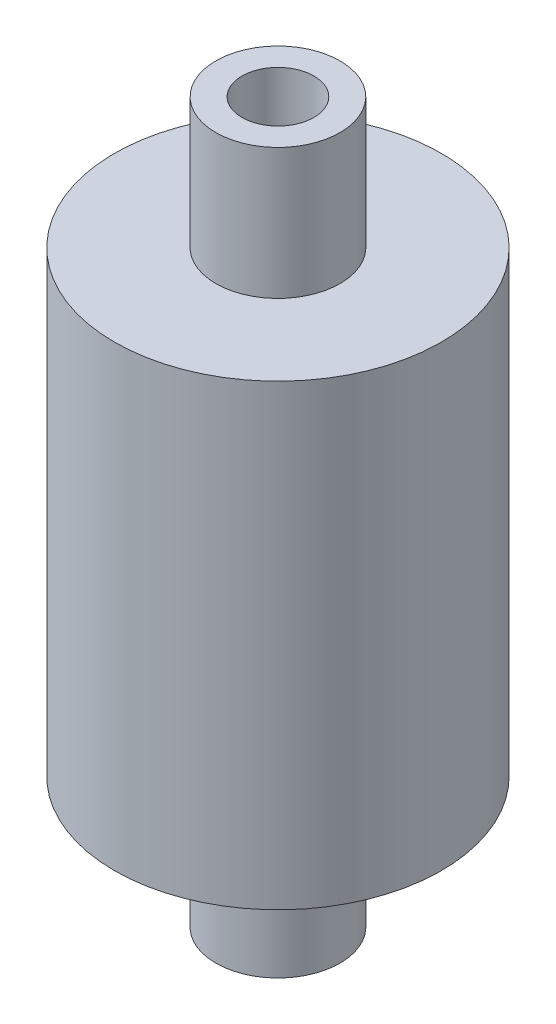
ISO-10303-21;
HEADER;
FILE_DESCRIPTION(('STEP AP214'),'2;1');
FILE_NAME('part.step','',(''),(''),'','','');
FILE_SCHEMA(('AUTOMOTIVE_DESIGN { 1 0 10303 214 1 1 1 1 }'));
ENDSEC;
DATA;
#1=APPLICATION_CONTEXT('core data for automotive mechanical design processes');
#2=APPLICATION_PROTOCOL_DEFINITION('international standard','automotive_design',2000,#1);
#3=PRODUCT_CONTEXT('',#1,'mechanical');
#4=PRODUCT('Part','Part','',(#3));
#5=PRODUCT_RELATED_PRODUCT_CATEGORY('part','',(#4));
#6=PRODUCT_DEFINITION_FORMATION('','',#4);
#7=PRODUCT_DEFINITION_CONTEXT('part definition',#1,'design');
#8=PRODUCT_DEFINITION('design','',#6,#7);
#9=PRODUCT_DEFINITION_SHAPE('','',#8);
#10=(LENGTH_UNIT() NAMED_UNIT(*) SI_UNIT(.MILLI.,.METRE.));
#11=(NAMED_UNIT(*) PLANE_ANGLE_UNIT() SI_UNIT($,.RADIAN.));
#12=(NAMED_UNIT(*) SI_UNIT($,.STERADIAN.) SOLID_ANGLE_UNIT());
#13=UNCERTAINTY_MEASURE_WITH_UNIT(LENGTH_MEASURE(1.E-05),#10,'distance_accuracy_value','');
#14=(GEOMETRIC_REPRESENTATION_CONTEXT(3) GLOBAL_UNCERTAINTY_ASSIGNED_CONTEXT((#13)) GLOBAL_UNIT_ASSIGNED_CONTEXT((#10,
#11,#12)) REPRESENTATION_CONTEXT('',''));
#15=CARTESIAN_POINT('',(0.,0.,0.));
#16=DIRECTION('',(0.,0.,1.));
#17=DIRECTION('',(1.,0.,0.));
#18=AXIS2_PLACEMENT_3D('',#15,#16,#17);
#19=CARTESIAN_POINT('',(0.,27.5,4.75000000000001));
#20=DIRECTION('',(0.,1.,0.));
#21=DIRECTION('',(0.,0.,1.));
#22=AXIS2_PLACEMENT_3D('',#19,#20,#21);
#23=PLANE('',#22);
#24=CARTESIAN_POINT('',(0.,27.5,0.));
#25=DIRECTION('',(0.,1.,0.));
#26=DIRECTION('',(0.,0.,1.));
#27=AXIS2_PLACEMENT_3D('',#24,#25,#26);
#28=CIRCLE('',#27,4.75000000000001);
#29=CARTESIAN_POINT('',(0.,27.5,4.75000000000001));
#30=VERTEX_POINT('',#29);
#31=EDGE_CURVE('E61',#30,#30,#28,.T.);
#32=ORIENTED_EDGE('',*,*,#31,.T.);
#33=EDGE_LOOP('',(#32));
#34=FACE_BOUND('',#33,.T.);
#35=CARTESIAN_POINT('',(0.,27.5,0.));
#36=DIRECTION('',(0.,1.,0.));
#37=DIRECTION('',(0.,0.,1.));
#38=AXIS2_PLACEMENT_3D('',#35,#36,#37);
#39=CIRCLE('',#38,2.75000000000001);
#40=CARTESIAN_POINT('',(0.,27.5,2.75000000000001));
#41=VERTEX_POINT('',#40);
#42=EDGE_CURVE('E10',#41,#41,#39,.T.);
#43=ORIENTED_EDGE('',*,*,#42,.F.);
#44=EDGE_LOOP('',(#43));
#45=FACE_BOUND('',#44,.T.);
#46=ADVANCED_FACE('F33',(#34,#45),#23,.T.);
#47=CARTESIAN_POINT('',(0.,59.0476190476191,0.));
#48=DIRECTION('',(0.,1.,0.));
#49=DIRECTION('',(0.,0.,1.));
#50=AXIS2_PLACEMENT_3D('',#47,#48,#49);
#51=CYLINDRICAL_SURFACE('',#50,2.75000000000001);
#52=ORIENTED_EDGE('',*,*,#42,.T.);
#53=EDGE_LOOP('',(#52));
#54=FACE_BOUND('',#53,.T.);
#55=CARTESIAN_POINT('',(0.,-27.5,0.));
#56=DIRECTION('',(0.,1.,0.));
#57=DIRECTION('',(0.,0.,1.));
#58=AXIS2_PLACEMENT_3D('',#55,#56,#57);
#59=CIRCLE('',#58,2.75000000000001);
#60=CARTESIAN_POINT('',(0.,-27.5,2.75000000000001));
#61=VERTEX_POINT('',#60);
#62=EDGE_CURVE('E39',#61,#61,#59,.T.);
#63=ORIENTED_EDGE('',*,*,#62,.F.);
#64=EDGE_LOOP('',(#63));
#65=FACE_BOUND('',#64,.T.);
#66=ADVANCED_FACE('F79',(#54,#65),#51,.F.);
#67=CARTESIAN_POINT('',(0.,-27.5,2.75000000000001));
#68=DIRECTION('',(0.,-1.,0.));
#69=DIRECTION('',(0.,0.,-1.));
#70=AXIS2_PLACEMENT_3D('',#67,#68,#69);
#71=PLANE('',#70);
#72=ORIENTED_EDGE('',*,*,#62,.T.);
#73=EDGE_LOOP('',(#72));
#74=FACE_BOUND('',#73,.T.);
#75=CARTESIAN_POINT('',(0.,-27.5,0.));
#76=DIRECTION('',(0.,1.,0.));
#77=DIRECTION('',(0.,0.,1.));
#78=AXIS2_PLACEMENT_3D('',#75,#76,#77);
#79=CIRCLE('',#78,4.75);
#80=CARTESIAN_POINT('',(0.,-27.5,4.75));
#81=VERTEX_POINT('',#80);
#82=EDGE_CURVE('E43',#81,#81,#79,.T.);
#83=ORIENTED_EDGE('',*,*,#82,.F.);
#84=EDGE_LOOP('',(#83));
#85=FACE_BOUND('',#84,.T.);
#86=ADVANCED_FACE('F83',(#74,#85),#71,.T.);
#87=CARTESIAN_POINT('',(0.,59.0476190476191,0.));
#88=DIRECTION('',(0.,1.,0.));
#89=DIRECTION('',(0.,0.,1.));
#90=AXIS2_PLACEMENT_3D('',#87,#88,#89);
#91=CYLINDRICAL_SURFACE('',#90,4.75);
#92=ORIENTED_EDGE('',*,*,#82,.T.);
#93=EDGE_LOOP('',(#92));
#94=FACE_BOUND('',#93,.T.);
#95=CARTESIAN_POINT('',(0.,-17.5,0.));
#96=DIRECTION('',(0.,1.,0.));
#97=DIRECTION('',(0.,0.,1.));
#98=AXIS2_PLACEMENT_3D('',#95,#96,#97);
#99=CIRCLE('',#98,4.74999999999999);
#100=CARTESIAN_POINT('',(0.,-17.5,4.74999999999999));
#101=VERTEX_POINT('',#100);
#102=EDGE_CURVE('E47',#101,#101,#99,.T.);
#103=ORIENTED_EDGE('',*,*,#102,.F.);
#104=EDGE_LOOP('',(#103));
#105=FACE_BOUND('',#104,.T.);
#106=ADVANCED_FACE('F87',(#94,#105),#91,.T.);
#107=CARTESIAN_POINT('',(0.,-17.5,12.5));
#108=DIRECTION('',(0.,-1.,0.));
#109=DIRECTION('',(0.,0.,-1.));
#110=AXIS2_PLACEMENT_3D('',#107,#108,#109);
#111=PLANE('',#110);
#112=ORIENTED_EDGE('',*,*,#102,.T.);
#113=EDGE_LOOP('',(#112));
#114=FACE_BOUND('',#113,.T.);
#115=CARTESIAN_POINT('',(0.,-17.5,0.));
#116=DIRECTION('',(0.,1.,0.));
#117=DIRECTION('',(0.,0.,1.));
#118=AXIS2_PLACEMENT_3D('',#115,#116,#117);
#119=CIRCLE('',#118,12.5);
#120=CARTESIAN_POINT('',(0.,-17.5,12.5));
#121=VERTEX_POINT('',#120);
#122=EDGE_CURVE('E52',#121,#121,#119,.T.);
#123=ORIENTED_EDGE('',*,*,#122,.F.);
#124=EDGE_LOOP('',(#123));
#125=FACE_BOUND('',#124,.T.);
#126=ADVANCED_FACE('F93',(#114,#125),#111,.T.);
#127=CARTESIAN_POINT('',(0.,59.0476190476191,0.));
#128=DIRECTION('',(0.,1.,0.));
#129=DIRECTION('',(0.,0.,1.));
#130=AXIS2_PLACEMENT_3D('',#127,#128,#129);
#131=CYLINDRICAL_SURFACE('',#130,12.5);
#132=ORIENTED_EDGE('',*,*,#122,.T.);
#133=EDGE_LOOP('',(#132));
#134=FACE_BOUND('',#133,.T.);
#135=CARTESIAN_POINT('',(0.,17.5,0.));
#136=DIRECTION('',(0.,1.,0.));
#137=DIRECTION('',(0.,0.,1.));
#138=AXIS2_PLACEMENT_3D('',#135,#136,#137);
#139=CIRCLE('',#138,12.5);
#140=CARTESIAN_POINT('',(0.,17.5,12.5));
#141=VERTEX_POINT('',#140);
#142=EDGE_CURVE('E55',#141,#141,#139,.T.);
#143=ORIENTED_EDGE('',*,*,#142,.F.);
#144=EDGE_LOOP('',(#143));
#145=FACE_BOUND('',#144,.T.);
#146=ADVANCED_FACE('F75',(#134,#145),#131,.T.);
#147=CARTESIAN_POINT('',(0.,17.5,4.74999999999999));
#148=DIRECTION('',(0.,1.,0.));
#149=DIRECTION('',(0.,0.,1.));
#150=AXIS2_PLACEMENT_3D('',#147,#148,#149);
#151=PLANE('',#150);
#152=ORIENTED_EDGE('',*,*,#142,.T.);
#153=EDGE_LOOP('',(#152));
#154=FACE_BOUND('',#153,.T.);
#155=CARTESIAN_POINT('',(0.,17.5,0.));
#156=DIRECTION('',(0.,1.,0.));
#157=DIRECTION('',(0.,0.,1.));
#158=AXIS2_PLACEMENT_3D('',#155,#156,#157);
#159=CIRCLE('',#158,4.74999999999999);
#160=CARTESIAN_POINT('',(0.,17.5,4.74999999999999));
#161=VERTEX_POINT('',#160);
#162=EDGE_CURVE('E58',#161,#161,#159,.T.);
#163=ORIENTED_EDGE('',*,*,#162,.F.);
#164=EDGE_LOOP('',(#163));
#165=FACE_BOUND('',#164,.T.);
#166=ADVANCED_FACE('F69',(#154,#165),#151,.T.);
#167=CARTESIAN_POINT('',(0.,59.0476190476191,0.));
#168=DIRECTION('',(0.,1.,0.));
#169=DIRECTION('',(0.,0.,1.));
#170=AXIS2_PLACEMENT_3D('',#167,#168,#169);
#171=CYLINDRICAL_SURFACE('',#170,4.75);
#172=ORIENTED_EDGE('',*,*,#162,.T.);
#173=EDGE_LOOP('',(#172));
#174=FACE_BOUND('',#173,.T.);
#175=ORIENTED_EDGE('',*,*,#31,.F.);
#176=EDGE_LOOP('',(#175));
#177=FACE_BOUND('',#176,.T.);
#178=ADVANCED_FACE('F67',(#174,#177),#171,.T.);
#179=CLOSED_SHELL('',(#46,#66,#86,#106,#126,#146,#166,#178));
#180=MANIFOLD_SOLID_BREP('B2',#179);
#181=ADVANCED_BREP_SHAPE_REPRESENTATION('',(#18,#180),#14);
#182=SHAPE_DEFINITION_REPRESENTATION(#9,#181);
ENDSEC;
END-ISO-10303-21;
